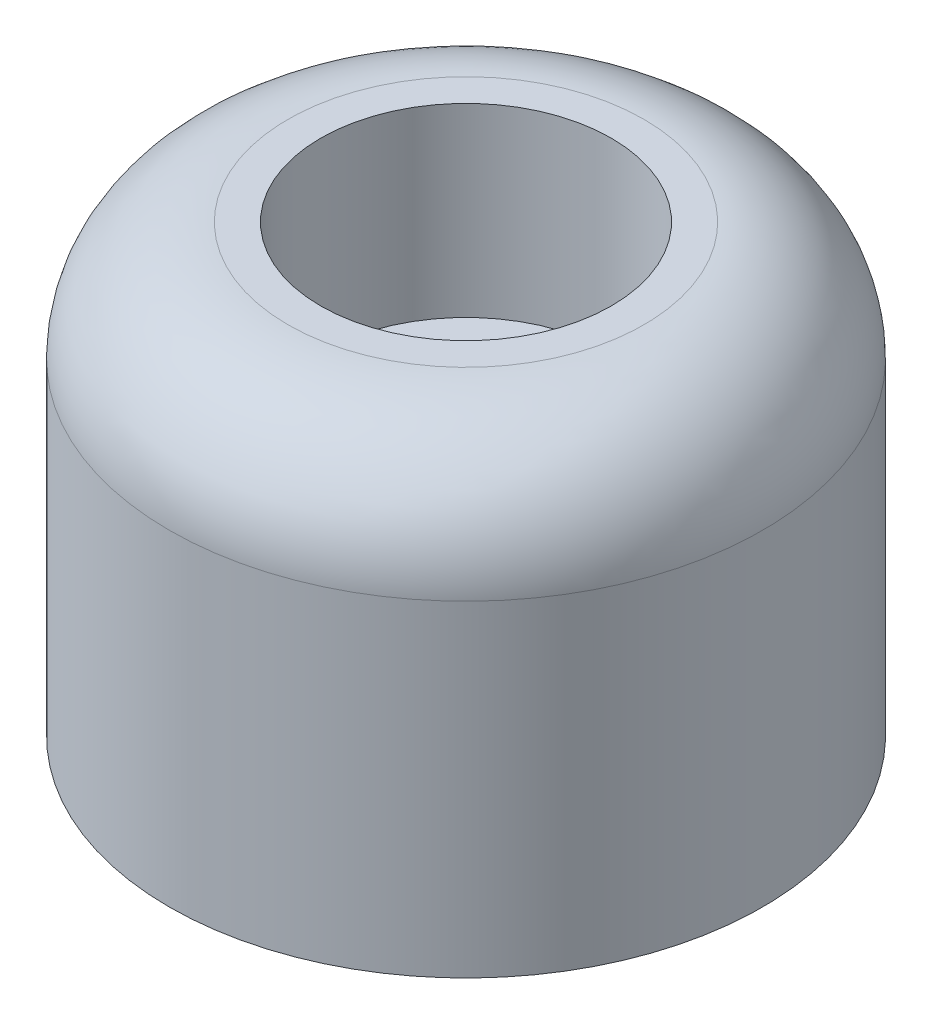
ISO-10303-21;
HEADER;
FILE_DESCRIPTION(('STEP AP214'),'2;1');
FILE_NAME('part.step','',(''),(''),'','','');
FILE_SCHEMA(('AUTOMOTIVE_DESIGN { 1 0 10303 214 1 1 1 1 }'));
ENDSEC;
DATA;
#1=APPLICATION_CONTEXT('core data for automotive mechanical design processes');
#2=APPLICATION_PROTOCOL_DEFINITION('international standard','automotive_design',2000,#1);
#3=PRODUCT_CONTEXT('',#1,'mechanical');
#4=PRODUCT('Part','Part','',(#3));
#5=PRODUCT_RELATED_PRODUCT_CATEGORY('part','',(#4));
#6=PRODUCT_DEFINITION_FORMATION('','',#4);
#7=PRODUCT_DEFINITION_CONTEXT('part definition',#1,'design');
#8=PRODUCT_DEFINITION('design','',#6,#7);
#9=PRODUCT_DEFINITION_SHAPE('','',#8);
#10=(LENGTH_UNIT() NAMED_UNIT(*) SI_UNIT(.MILLI.,.METRE.));
#11=(NAMED_UNIT(*) PLANE_ANGLE_UNIT() SI_UNIT($,.RADIAN.));
#12=(NAMED_UNIT(*) SI_UNIT($,.STERADIAN.) SOLID_ANGLE_UNIT());
#13=UNCERTAINTY_MEASURE_WITH_UNIT(LENGTH_MEASURE(1.E-05),#10,'distance_accuracy_value','');
#14=(GEOMETRIC_REPRESENTATION_CONTEXT(3) GLOBAL_UNCERTAINTY_ASSIGNED_CONTEXT((#13)) GLOBAL_UNIT_ASSIGNED_CONTEXT((#10,
#11,#12)) REPRESENTATION_CONTEXT('',''));
#15=CARTESIAN_POINT('',(0.,0.,0.));
#16=DIRECTION('',(0.,0.,1.));
#17=DIRECTION('',(1.,0.,0.));
#18=AXIS2_PLACEMENT_3D('',#15,#16,#17);
#19=CARTESIAN_POINT('',(0.,19.05,0.));
#20=DIRECTION('',(0.,-1.,0.));
#21=DIRECTION('',(0.,0.,-1.));
#22=AXIS2_PLACEMENT_3D('',#19,#20,#21);
#23=CYLINDRICAL_SURFACE('',#22,12.7);
#24=CARTESIAN_POINT('',(0.,13.97,0.));
#25=DIRECTION('',(0.,1.,0.));
#26=DIRECTION('',(0.,0.,1.));
#27=AXIS2_PLACEMENT_3D('',#24,#25,#26);
#28=CIRCLE('',#27,12.7);
#29=CARTESIAN_POINT('',(0.,13.97,-12.7));
#30=VERTEX_POINT('',#29);
#31=EDGE_CURVE('E10',#30,#30,#28,.F.);
#32=CARTESIAN_POINT('',(0.,0.,0.));
#33=DIRECTION('',(0.,1.,0.));
#34=DIRECTION('',(0.,0.,1.));
#35=AXIS2_PLACEMENT_3D('',#32,#33,#34);
#36=CIRCLE('',#35,12.7);
#37=CARTESIAN_POINT('',(0.,0.,-12.7));
#38=VERTEX_POINT('',#37);
#39=EDGE_CURVE('E41',#38,#38,#36,.T.);
#40=CARTESIAN_POINT('',(0.,13.97,-12.7));
#41=CARTESIAN_POINT('',(0.,13.8244791666667,-12.7));
#42=CARTESIAN_POINT('',(0.,13.6789583333333,-12.7));
#43=CARTESIAN_POINT('',(0.,13.3879166666667,-12.7));
#44=CARTESIAN_POINT('',(0.,13.2423958333333,-12.7));
#45=CARTESIAN_POINT('',(0.,12.9513541666667,-12.7));
#46=CARTESIAN_POINT('',(0.,12.8058333333333,-12.7));
#47=CARTESIAN_POINT('',(0.,12.5147916666667,-12.7));
#48=CARTESIAN_POINT('',(0.,12.3692708333333,-12.7));
#49=CARTESIAN_POINT('',(0.,12.0782291666667,-12.7));
#50=CARTESIAN_POINT('',(0.,11.9327083333333,-12.7));
#51=CARTESIAN_POINT('',(0.,11.6416666666667,-12.7));
#52=CARTESIAN_POINT('',(0.,11.4961458333333,-12.7));
#53=CARTESIAN_POINT('',(0.,11.2051041666667,-12.7));
#54=CARTESIAN_POINT('',(0.,11.0595833333333,-12.7));
#55=CARTESIAN_POINT('',(0.,10.7685416666667,-12.7));
#56=CARTESIAN_POINT('',(0.,10.6230208333333,-12.7));
#57=CARTESIAN_POINT('',(0.,10.3319791666667,-12.7));
#58=CARTESIAN_POINT('',(0.,10.1864583333333,-12.7));
#59=CARTESIAN_POINT('',(0.,9.89541666666667,-12.7));
#60=CARTESIAN_POINT('',(0.,9.74989583333333,-12.7));
#61=CARTESIAN_POINT('',(0.,9.45885416666667,-12.7));
#62=CARTESIAN_POINT('',(0.,9.31333333333333,-12.7));
#63=CARTESIAN_POINT('',(0.,9.02229166666666,-12.7));
#64=CARTESIAN_POINT('',(0.,8.87677083333333,-12.7));
#65=CARTESIAN_POINT('',(0.,8.58572916666667,-12.7));
#66=CARTESIAN_POINT('',(0.,8.44020833333333,-12.7));
#67=CARTESIAN_POINT('',(0.,8.14916666666667,-12.7));
#68=CARTESIAN_POINT('',(0.,8.00364583333333,-12.7));
#69=CARTESIAN_POINT('',(0.,7.71260416666667,-12.7));
#70=CARTESIAN_POINT('',(0.,7.56708333333333,-12.7));
#71=CARTESIAN_POINT('',(0.,7.27604166666666,-12.7));
#72=CARTESIAN_POINT('',(0.,7.13052083333333,-12.7));
#73=CARTESIAN_POINT('',(0.,6.83947916666666,-12.7));
#74=CARTESIAN_POINT('',(0.,6.69395833333333,-12.7));
#75=CARTESIAN_POINT('',(0.,6.40291666666667,-12.7));
#76=CARTESIAN_POINT('',(0.,6.25739583333333,-12.7));
#77=CARTESIAN_POINT('',(0.,5.96635416666666,-12.7));
#78=CARTESIAN_POINT('',(0.,5.82083333333333,-12.7));
#79=CARTESIAN_POINT('',(0.,5.52979166666666,-12.7));
#80=CARTESIAN_POINT('',(0.,5.38427083333333,-12.7));
#81=CARTESIAN_POINT('',(0.,5.09322916666667,-12.7));
#82=CARTESIAN_POINT('',(0.,4.94770833333333,-12.7));
#83=CARTESIAN_POINT('',(0.,4.65666666666666,-12.7));
#84=CARTESIAN_POINT('',(0.,4.51114583333333,-12.7));
#85=CARTESIAN_POINT('',(0.,4.22010416666666,-12.7));
#86=CARTESIAN_POINT('',(0.,4.07458333333333,-12.7));
#87=CARTESIAN_POINT('',(0.,3.78354166666666,-12.7));
#88=CARTESIAN_POINT('',(0.,3.63802083333333,-12.7));
#89=CARTESIAN_POINT('',(0.,3.34697916666667,-12.7));
#90=CARTESIAN_POINT('',(0.,3.20145833333333,-12.7));
#91=CARTESIAN_POINT('',(0.,2.91041666666667,-12.7));
#92=CARTESIAN_POINT('',(0.,2.76489583333333,-12.7));
#93=CARTESIAN_POINT('',(0.,2.47385416666667,-12.7));
#94=CARTESIAN_POINT('',(0.,2.32833333333333,-12.7));
#95=CARTESIAN_POINT('',(0.,2.03729166666667,-12.7));
#96=CARTESIAN_POINT('',(0.,1.89177083333333,-12.7));
#97=CARTESIAN_POINT('',(0.,1.60072916666667,-12.7));
#98=CARTESIAN_POINT('',(0.,1.45520833333333,-12.7));
#99=CARTESIAN_POINT('',(0.,1.16416666666667,-12.7));
#100=CARTESIAN_POINT('',(0.,1.01864583333334,-12.7));
#101=CARTESIAN_POINT('',(0.,0.727604166666669,-12.7));
#102=CARTESIAN_POINT('',(0.,0.582083333333335,-12.7));
#103=CARTESIAN_POINT('',(0.,0.291041666666667,-12.7));
#104=CARTESIAN_POINT('',(0.,0.145520833333334,-12.7));
#105=CARTESIAN_POINT('',(0.,0.,-12.7));
#106=B_SPLINE_CURVE_WITH_KNOTS('',3,(#40,#41,#42,#43,#44,#45,#46,#47,#48,#49,#50,#51,#52,#53,
#54,#55,#56,#57,#58,#59,#60,#61,#62,#63,#64,#65,#66,#67,#68,#69,#70,#71,#72,#73,#74,#75,#76,#77,
#78,#79,#80,#81,#82,#83,#84,#85,#86,#87,#88,#89,#90,#91,#92,#93,#94,#95,#96,#97,#98,#99,#100,
#101,#102,#103,#104,#105),.UNSPECIFIED.,.F.,.F.,(4,2,2,2,2,2,2,2,2,2,2,2,2,2,2,2,2,2,2,2,2,2,2,
2,2,2,2,2,2,2,2,2,4),(0.,0.436562499999999,0.873124999999999,1.3096875,1.74625,2.1828125,
2.619375,3.0559375,3.4925,3.9290625,4.365625,4.8021875,5.23875,5.6753125,6.111875,6.5484375,
6.985,7.4215625,7.858125,8.2946875,8.73125,9.1678125,9.604375,10.0409375,10.4775,10.9140625,
11.350625,11.7871875,12.22375,12.6603125,13.096875,13.5334375,13.97),.UNSPECIFIED.);
#107=EDGE_CURVE('BSEAM30',#30,#38,#106,.T.);
#108=ORIENTED_EDGE('',*,*,#31,.T.);
#109=ORIENTED_EDGE('',*,*,#39,.T.);
#110=ORIENTED_EDGE('',*,*,#107,.T.);
#111=ORIENTED_EDGE('',*,*,#107,.F.);
#112=EDGE_LOOP('',(#108,#110,#109,#111));
#113=FACE_BOUND('',#112,.T.);
#114=ADVANCED_FACE('F30',(#113),#23,.T.);
#115=CARTESIAN_POINT('',(0.,19.05,0.));
#116=DIRECTION('',(0.,1.,0.));
#117=DIRECTION('',(0.,0.,1.));
#118=AXIS2_PLACEMENT_3D('',#115,#116,#117);
#119=PLANE('',#118);
#120=CARTESIAN_POINT('',(0.,19.05,0.));
#121=DIRECTION('',(0.,1.,0.));
#122=DIRECTION('',(0.,0.,1.));
#123=AXIS2_PLACEMENT_3D('',#120,#121,#122);
#124=CIRCLE('',#123,7.62);
#125=CARTESIAN_POINT('',(0.,19.05,7.62));
#126=VERTEX_POINT('',#125);
#127=EDGE_CURVE('E37',#126,#126,#124,.T.);
#128=ORIENTED_EDGE('',*,*,#127,.T.);
#129=EDGE_LOOP('',(#128));
#130=FACE_BOUND('',#129,.T.);
#131=CARTESIAN_POINT('',(0.,19.05,0.));
#132=DIRECTION('',(0.,1.,0.));
#133=DIRECTION('',(0.,0.,1.));
#134=AXIS2_PLACEMENT_3D('',#131,#132,#133);
#135=CIRCLE('',#134,6.223);
#136=CARTESIAN_POINT('',(0.,19.05,6.223));
#137=VERTEX_POINT('',#136);
#138=EDGE_CURVE('E56',#137,#137,#135,.T.);
#139=ORIENTED_EDGE('',*,*,#138,.F.);
#140=EDGE_LOOP('',(#139));
#141=FACE_BOUND('',#140,.T.);
#142=ADVANCED_FACE('F62',(#130,#141),#119,.T.);
#143=CARTESIAN_POINT('',(0.,0.,0.));
#144=DIRECTION('',(0.,1.,0.));
#145=DIRECTION('',(0.,0.,1.));
#146=AXIS2_PLACEMENT_3D('',#143,#144,#145);
#147=PLANE('',#146);
#148=CARTESIAN_POINT('',(0.,0.,0.));
#149=DIRECTION('',(0.,1.,0.));
#150=DIRECTION('',(0.,0.,1.));
#151=AXIS2_PLACEMENT_3D('',#148,#149,#150);
#152=CIRCLE('',#151,4.10209999999999);
#153=CARTESIAN_POINT('',(0.,0.,4.10209999999999));
#154=VERTEX_POINT('',#153);
#155=EDGE_CURVE('E45',#154,#154,#152,.T.);
#156=ORIENTED_EDGE('',*,*,#155,.T.);
#157=EDGE_LOOP('',(#156));
#158=FACE_BOUND('',#157,.T.);
#159=ORIENTED_EDGE('',*,*,#39,.F.);
#160=EDGE_LOOP('',(#159));
#161=FACE_BOUND('',#160,.T.);
#162=ADVANCED_FACE('F64',(#158,#161),#147,.F.);
#163=CARTESIAN_POINT('',(0.,19.05,0.));
#164=DIRECTION('',(0.,1.,0.));
#165=DIRECTION('',(0.,0.,1.));
#166=AXIS2_PLACEMENT_3D('',#163,#164,#165);
#167=CYLINDRICAL_SURFACE('',#166,4.10209999999999);
#168=CARTESIAN_POINT('',(0.,11.1125,0.));
#169=DIRECTION('',(0.,1.,0.));
#170=DIRECTION('',(0.,0.,1.));
#171=AXIS2_PLACEMENT_3D('',#168,#169,#170);
#172=CIRCLE('',#171,4.10209999999999);
#173=CARTESIAN_POINT('',(0.,11.1125,4.10209999999999));
#174=VERTEX_POINT('',#173);
#175=EDGE_CURVE('E49',#174,#174,#172,.T.);
#176=ORIENTED_EDGE('',*,*,#175,.T.);
#177=EDGE_LOOP('',(#176));
#178=FACE_BOUND('',#177,.T.);
#179=ORIENTED_EDGE('',*,*,#155,.F.);
#180=EDGE_LOOP('',(#179));
#181=FACE_BOUND('',#180,.T.);
#182=ADVANCED_FACE('F70',(#178,#181),#167,.F.);
#183=CARTESIAN_POINT('',(4.10209999999999,11.1125,0.));
#184=DIRECTION('',(0.,-1.,0.));
#185=DIRECTION('',(0.,0.,-1.));
#186=AXIS2_PLACEMENT_3D('',#183,#184,#185);
#187=PLANE('',#186);
#188=ORIENTED_EDGE('',*,*,#175,.F.);
#189=EDGE_LOOP('',(#188));
#190=FACE_BOUND('',#189,.T.);
#191=CARTESIAN_POINT('',(0.,11.1125,0.));
#192=DIRECTION('',(0.,1.,0.));
#193=DIRECTION('',(0.,0.,1.));
#194=AXIS2_PLACEMENT_3D('',#191,#192,#193);
#195=CIRCLE('',#194,6.223);
#196=CARTESIAN_POINT('',(0.,11.1125,6.223));
#197=VERTEX_POINT('',#196);
#198=EDGE_CURVE('E53',#197,#197,#195,.T.);
#199=ORIENTED_EDGE('',*,*,#198,.T.);
#200=EDGE_LOOP('',(#199));
#201=FACE_BOUND('',#200,.T.);
#202=ADVANCED_FACE('F76',(#190,#201),#187,.F.);
#203=CARTESIAN_POINT('',(0.,19.05,0.));
#204=DIRECTION('',(0.,1.,0.));
#205=DIRECTION('',(0.,0.,1.));
#206=AXIS2_PLACEMENT_3D('',#203,#204,#205);
#207=CYLINDRICAL_SURFACE('',#206,6.223);
#208=ORIENTED_EDGE('',*,*,#198,.F.);
#209=EDGE_LOOP('',(#208));
#210=FACE_BOUND('',#209,.T.);
#211=ORIENTED_EDGE('',*,*,#138,.T.);
#212=EDGE_LOOP('',(#211));
#213=FACE_BOUND('',#212,.T.);
#214=ADVANCED_FACE('F60',(#210,#213),#207,.F.);
#215=CARTESIAN_POINT('',(0.,13.97,0.));
#216=DIRECTION('',(0.,1.,0.));
#217=DIRECTION('',(0.,0.,1.));
#218=AXIS2_PLACEMENT_3D('',#215,#216,#217);
#219=TOROIDAL_SURFACE('',#218,7.62,5.08);
#220=ORIENTED_EDGE('',*,*,#31,.F.);
#221=EDGE_LOOP('',(#220));
#222=FACE_BOUND('',#221,.T.);
#223=ORIENTED_EDGE('',*,*,#127,.F.);
#224=EDGE_LOOP('',(#223));
#225=FACE_BOUND('',#224,.T.);
#226=ADVANCED_FACE('F32',(#222,#225),#219,.T.);
#227=CLOSED_SHELL('',(#114,#142,#162,#182,#202,#214,#226));
#228=MANIFOLD_SOLID_BREP('B2',#227);
#229=ADVANCED_BREP_SHAPE_REPRESENTATION('',(#18,#228),#14);
#230=SHAPE_DEFINITION_REPRESENTATION(#9,#229);
ENDSEC;
END-ISO-10303-21;
